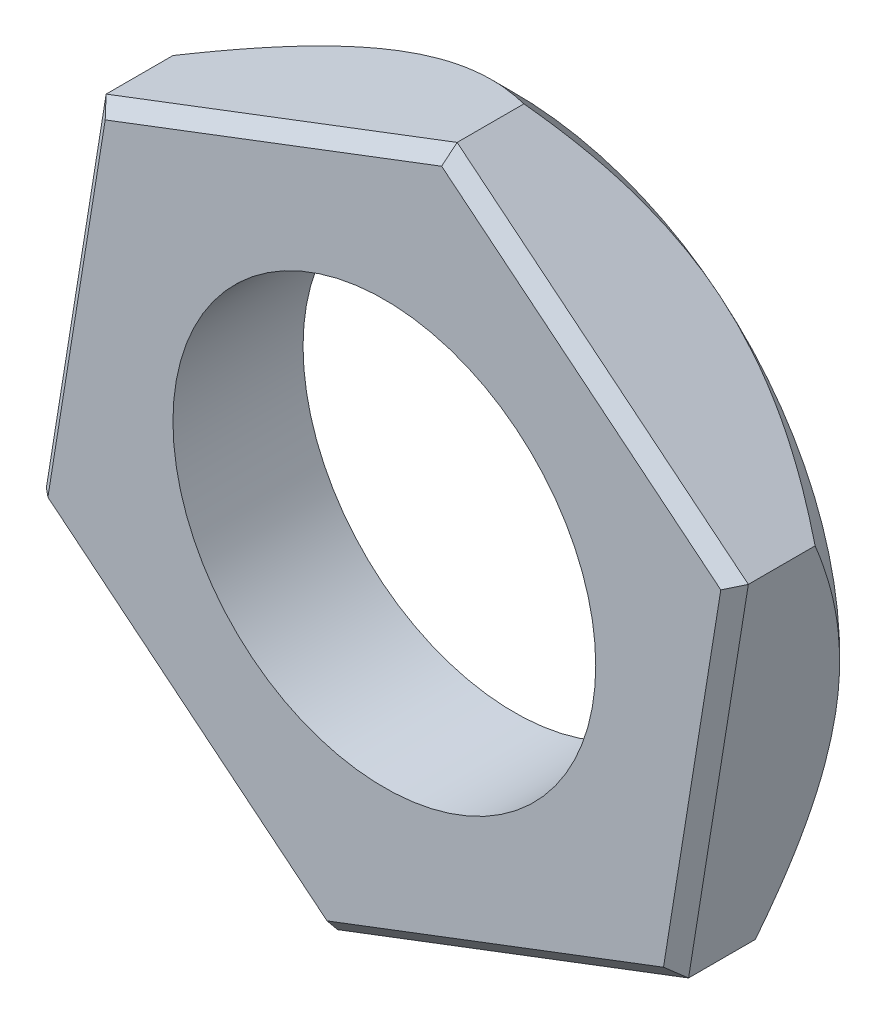
ISO-10303-21;
HEADER;
FILE_DESCRIPTION(('STEP AP214'),'2;1');
FILE_NAME('part.step','',(''),(''),'','','');
FILE_SCHEMA(('AUTOMOTIVE_DESIGN { 1 0 10303 214 1 1 1 1 }'));
ENDSEC;
DATA;
#1=APPLICATION_CONTEXT('core data for automotive mechanical design processes');
#2=APPLICATION_PROTOCOL_DEFINITION('international standard','automotive_design',2000,#1);
#3=PRODUCT_CONTEXT('',#1,'mechanical');
#4=PRODUCT('Part','Part','',(#3));
#5=PRODUCT_RELATED_PRODUCT_CATEGORY('part','',(#4));
#6=PRODUCT_DEFINITION_FORMATION('','',#4);
#7=PRODUCT_DEFINITION_CONTEXT('part definition',#1,'design');
#8=PRODUCT_DEFINITION('design','',#6,#7);
#9=PRODUCT_DEFINITION_SHAPE('','',#8);
#10=(LENGTH_UNIT() NAMED_UNIT(*) SI_UNIT(.MILLI.,.METRE.));
#11=(NAMED_UNIT(*) PLANE_ANGLE_UNIT() SI_UNIT($,.RADIAN.));
#12=(NAMED_UNIT(*) SI_UNIT($,.STERADIAN.) SOLID_ANGLE_UNIT());
#13=UNCERTAINTY_MEASURE_WITH_UNIT(LENGTH_MEASURE(1.E-05),#10,'distance_accuracy_value','');
#14=(GEOMETRIC_REPRESENTATION_CONTEXT(3) GLOBAL_UNCERTAINTY_ASSIGNED_CONTEXT((#13)) GLOBAL_UNIT_ASSIGNED_CONTEXT((#10,
#11,#12)) REPRESENTATION_CONTEXT('',''));
#15=CARTESIAN_POINT('',(0.,0.,0.));
#16=DIRECTION('',(0.,0.,1.));
#17=DIRECTION('',(1.,0.,0.));
#18=AXIS2_PLACEMENT_3D('',#15,#16,#17);
#19=CARTESIAN_POINT('',(0.,0.,0.));
#20=DIRECTION('',(0.,0.,1.));
#21=DIRECTION('',(1.,0.,0.));
#22=AXIS2_PLACEMENT_3D('',#19,#20,#21);
#23=PLANE('',#22);
#24=CARTESIAN_POINT('',(0.,0.,0.));
#25=DIRECTION('',(0.,0.,1.));
#26=DIRECTION('',(1.,0.,0.));
#27=AXIS2_PLACEMENT_3D('',#24,#25,#26);
#28=CIRCLE('',#27,3.25);
#29=CARTESIAN_POINT('',(3.25,0.,0.));
#30=VERTEX_POINT('',#29);
#31=EDGE_CURVE('E325',#30,#30,#28,.T.);
#32=ORIENTED_EDGE('',*,*,#31,.T.);
#33=EDGE_LOOP('',(#32));
#34=FACE_BOUND('',#33,.T.);
#35=CARTESIAN_POINT('',(0.,0.,0.));
#36=DIRECTION('',(0.,0.,-1.));
#37=DIRECTION('',(-1.,0.,0.));
#38=AXIS2_PLACEMENT_3D('',#35,#36,#37);
#39=CIRCLE('',#38,5.);
#40=CARTESIAN_POINT('',(-1.77905213864237,4.67279076013382,0.));
#41=VERTEX_POINT('',#40);
#42=CARTESIAN_POINT('',(3.1572294355239,3.87709972678824,0.));
#43=VERTEX_POINT('',#42);
#44=EDGE_CURVE('E135',#41,#43,#39,.T.);
#45=ORIENTED_EDGE('',*,*,#44,.T.);
#46=CARTESIAN_POINT('',(4.93628157416627,-0.795691033345577,0.));
#47=VERTEX_POINT('',#46);
#48=EDGE_CURVE('E124',#43,#47,#39,.T.);
#49=ORIENTED_EDGE('',*,*,#48,.T.);
#50=CARTESIAN_POINT('',(1.77905213864238,-4.67279076013382,0.));
#51=VERTEX_POINT('',#50);
#52=EDGE_CURVE('E136',#47,#51,#39,.T.);
#53=ORIENTED_EDGE('',*,*,#52,.T.);
#54=CARTESIAN_POINT('',(-3.15722943552389,-3.87709972678824,0.));
#55=VERTEX_POINT('',#54);
#56=EDGE_CURVE('E284',#51,#55,#39,.T.);
#57=ORIENTED_EDGE('',*,*,#56,.T.);
#58=CARTESIAN_POINT('',(-4.93628157416627,0.795691033345573,0.));
#59=VERTEX_POINT('',#58);
#60=EDGE_CURVE('E157',#55,#59,#39,.T.);
#61=ORIENTED_EDGE('',*,*,#60,.T.);
#62=EDGE_CURVE('E149',#59,#41,#39,.T.);
#63=ORIENTED_EDGE('',*,*,#62,.T.);
#64=EDGE_LOOP('',(#45,#49,#53,#57,#61,#63));
#65=FACE_BOUND('',#64,.T.);
#66=ADVANCED_FACE('F33',(#34,#65),#23,.F.);
#67=CARTESIAN_POINT('',(-4.47688914187243,3.64565452898627,2.));
#68=DIRECTION('',(0.987256314833254,-0.159138206669115,0.));
#69=DIRECTION('',(0.159138206669115,0.987256314833254,0.));
#70=AXIS2_PLACEMENT_3D('',#67,#68,#69);
#71=PLANE('',#70);
#72=DIRECTION('',(0.,0.,-1.));
#73=VECTOR('',#72,1.);
#74=CARTESIAN_POINT('',(-5.3956740064601,-2.05427246229511,2.));
#75=LINE('',#74,#73);
#76=CARTESIAN_POINT('',(-5.3956740064601,-2.05427246229511,1.8));
#77=VERTEX_POINT('',#76);
#78=CARTESIAN_POINT('',(-5.3956740064601,-2.05427246229511,0.773502691896245));
#79=VERTEX_POINT('',#78);
#80=EDGE_CURVE('E316',#77,#79,#75,.T.);
#81=ORIENTED_EDGE('',*,*,#80,.F.);
#82=DIRECTION('',(0.159138206669115,0.987256314833254,0.));
#83=VECTOR('',#82,1.);
#84=CARTESIAN_POINT('',(-4.47688914187243,3.64565452898627,1.8));
#85=LINE('',#84,#83);
#86=CARTESIAN_POINT('',(-4.47688914187243,3.64565452898627,1.8));
#87=VERTEX_POINT('',#86);
#88=EDGE_CURVE('E42',#77,#87,#85,.T.);
#89=ORIENTED_EDGE('',*,*,#88,.T.);
#90=DIRECTION('',(0.,0.,-1.));
#91=VECTOR('',#90,1.);
#92=CARTESIAN_POINT('',(-4.47688914187243,3.64565452898627,2.));
#93=LINE('',#92,#91);
#94=CARTESIAN_POINT('',(-4.47688914187243,3.64565452898627,0.773502691896249));
#95=VERTEX_POINT('',#94);
#96=EDGE_CURVE('E266',#87,#95,#93,.T.);
#97=ORIENTED_EDGE('',*,*,#96,.T.);
#98=CARTESIAN_POINT('',(-5.39570624493846,-2.05447246229511,0.773603985380079));
#99=CARTESIAN_POINT('',(-5.37990828535588,-1.95646560595417,0.72397285033257));
#100=CARTESIAN_POINT('',(-5.36398889478862,-1.85770542010827,0.675864812806547));
#101=CARTESIAN_POINT('',(-5.331883428467,-1.65853059572059,0.583158255487634));
#102=CARTESIAN_POINT('',(-5.31569721281281,-1.55811508927293,0.53856165245695));
#103=CARTESIAN_POINT('',(-5.26655221862284,-1.25323100849795,0.410353673917441));
#104=CARTESIAN_POINT('',(-5.23317740223007,-1.04618143234764,0.33287107448098));
#105=CARTESIAN_POINT('',(-5.1658744149064,-0.628649397563627,0.200187428722699));
#106=CARTESIAN_POINT('',(-5.13196344630485,-0.418273658168715,0.144652105392841));
#107=CARTESIAN_POINT('',(-5.08053948212892,-0.0992513791756916,0.0804113577927177));
#108=CARTESIAN_POINT('',(-5.06332245046184,0.00755906937582048,0.0621834059785219));
#109=CARTESIAN_POINT('',(-5.02874260781945,0.222084347303721,0.0324940647279748));
#110=CARTESIAN_POINT('',(-5.01137981902437,0.329799039079164,0.0210316640346012));
#111=CARTESIAN_POINT('',(-4.96906921569646,0.592284153082797,0.00181334794427144));
#112=CARTESIAN_POINT('',(-4.94407581347038,0.74733739072657,-0.00221906551645336));
#113=CARTESIAN_POINT('',(-4.89413405452889,1.05716441417283,0.00454880191539594));
#114=CARTESIAN_POINT('',(-4.86918571667283,1.21193808297632,0.015354282269621));
#115=CARTESIAN_POINT('',(-4.81952424835932,1.52002624874503,0.0511609953830387));
#116=CARTESIAN_POINT('',(-4.79481141241852,1.67333891859756,0.0761781035664301));
#117=CARTESIAN_POINT('',(-4.74581049334059,1.97732919098329,0.139047982880621));
#118=CARTESIAN_POINT('',(-4.72152237778431,2.12800699463731,0.17689976979624));
#119=CARTESIAN_POINT('',(-4.67840639539026,2.39548849251082,0.254772950518885));
#120=CARTESIAN_POINT('',(-4.6594830610612,2.51288444477833,0.292746394018213));
#121=CARTESIAN_POINT('',(-4.62197609245859,2.7455689294048,0.374812647595885));
#122=CARTESIAN_POINT('',(-4.60339246851088,2.8608573977046,0.418905643335503));
#123=CARTESIAN_POINT('',(-4.56662345225735,3.08896379808638,0.512222579898621));
#124=CARTESIAN_POINT('',(-4.54843701421571,3.20178821766949,0.561430385197737));
#125=CARTESIAN_POINT('',(-4.51240090460815,3.42534783617175,0.664330881237279));
#126=CARTESIAN_POINT('',(-4.49455103461817,3.53608426606757,0.718020821301213));
#127=CARTESIAN_POINT('',(-4.47685690339407,3.64585452898627,0.773603985380083));
#128=B_SPLINE_CURVE_WITH_KNOTS('',3,(#98,#99,#100,#101,#102,#103,#104,#105,#106,#107,#108,#109,
#110,#111,#112,#113,#114,#115,#116,#117,#118,#119,#120,#121,#122,#123,#124,#125,#126,#127),
.UNSPECIFIED.,.F.,.F.,(4,2,2,2,2,2,2,2,2,2,2,2,2,2,4),(0.,0.332942258609129,0.666065015968434,
1.33590706242885,1.99511252166244,2.32406874369522,2.65297578369077,3.12356282013711,
3.59431480073053,4.06559368258843,4.53683643304182,4.91114298755202,5.28546090064319,
5.65863187874306,6.03157550285055),.UNSPECIFIED.);
#129=EDGE_CURVE('E148',#59,#95,#128,.T.);
#130=ORIENTED_EDGE('',*,*,#129,.F.);
#131=EDGE_CURVE('E154',#79,#59,#128,.T.);
#132=ORIENTED_EDGE('',*,*,#131,.F.);
#133=EDGE_LOOP('',(#81,#89,#97,#130,#132));
#134=FACE_BOUND('',#133,.T.);
#135=ADVANCED_FACE('F219',(#134),#71,.F.);
#136=CARTESIAN_POINT('',(-5.3956740064601,-2.05427246229511,2.));
#137=DIRECTION('',(0.631445887104779,0.775419945357648,0.));
#138=DIRECTION('',(-0.775419945357648,0.631445887104779,0.));
#139=AXIS2_PLACEMENT_3D('',#136,#137,#138);
#140=PLANE('',#139);
#141=DIRECTION('',(0.,0.,-1.));
#142=VECTOR('',#141,1.);
#143=CARTESIAN_POINT('',(-0.918784864587673,-5.69992699128137,2.));
#144=LINE('',#143,#142);
#145=CARTESIAN_POINT('',(-0.918784864587673,-5.69992699128137,1.8));
#146=VERTEX_POINT('',#145);
#147=CARTESIAN_POINT('',(-0.918784864587673,-5.69992699128137,0.773502691896252));
#148=VERTEX_POINT('',#147);
#149=EDGE_CURVE('E317',#146,#148,#144,.T.);
#150=ORIENTED_EDGE('',*,*,#149,.F.);
#151=DIRECTION('',(-0.775419945357648,0.631445887104779,0.));
#152=VECTOR('',#151,1.);
#153=CARTESIAN_POINT('',(-5.3956740064601,-2.05427246229511,1.8));
#154=LINE('',#153,#152);
#155=EDGE_CURVE('E57',#146,#77,#154,.T.);
#156=ORIENTED_EDGE('',*,*,#155,.T.);
#157=ORIENTED_EDGE('',*,*,#80,.T.);
#158=CARTESIAN_POINT('',(-0.918584864587673,-5.70008985680757,0.773631658594961));
#159=CARTESIAN_POINT('',(-0.995563605871024,-5.63740394078376,0.723998976215254));
#160=CARTESIAN_POINT('',(-1.07313405041158,-5.57423618444828,0.675889411018732));
#161=CARTESIAN_POINT('',(-1.22957443703417,-5.44684245502293,0.583179854846174));
#162=CARTESIAN_POINT('',(-1.30844506083946,-5.38261592678697,0.538581780728499));
#163=CARTESIAN_POINT('',(-1.54791411579233,-5.18760965857818,0.410369462227134));
#164=CARTESIAN_POINT('',(-1.71053981502556,-5.05517905818783,0.332884116564412));
#165=CARTESIAN_POINT('',(-2.03848757869879,-4.7881221327161,0.200195640062594));
#166=CARTESIAN_POINT('',(-2.20372581509662,-4.6535640711257,0.144658208167137));
#167=CARTESIAN_POINT('',(-2.4542998541133,-4.44951470755234,0.0804149254963863));
#168=CARTESIAN_POINT('',(-2.53819345831217,-4.38119782759211,0.0621862342483763));
#169=CARTESIAN_POINT('',(-2.7066910351602,-4.2439855950144,0.0324956538378238));
#170=CARTESIAN_POINT('',(-2.79129489971842,-4.17509033041836,0.0210327533004237));
#171=CARTESIAN_POINT('',(-2.99746010047066,-4.00720431090272,0.00181374936369778));
#172=CARTESIAN_POINT('',(-3.11924356609716,-3.90803266984859,-0.00221897638376468));
#173=CARTESIAN_POINT('',(-3.36259103085079,-3.70986810537484,0.0045483025111792));
#174=CARTESIAN_POINT('',(-3.48415493808896,-3.61087525678295,0.0153535067560873));
#175=CARTESIAN_POINT('',(-3.72613670058024,-3.4138228213971,0.0511597199350075));
#176=CARTESIAN_POINT('',(-3.84655312068625,-3.31576440328309,0.0761766054147195));
#177=CARTESIAN_POINT('',(-4.08531630797688,-3.12133294261547,0.139046097796503));
#178=CARTESIAN_POINT('',(-4.20366323311952,-3.02495977143227,0.176897720527023));
#179=CARTESIAN_POINT('',(-4.41375556177589,-2.85387578315397,0.25477222494053));
#180=CARTESIAN_POINT('',(-4.50596606949126,-2.77878621885619,0.292747464177998));
#181=CARTESIAN_POINT('',(-4.68873170335424,-2.62995511321105,0.374817859296279));
#182=CARTESIAN_POINT('',(-4.77928677909673,-2.55621361290996,0.418913201173826));
#183=CARTESIAN_POINT('',(-4.95845634135226,-2.41031088773769,0.512235259951131));
#184=CARTESIAN_POINT('',(-5.04707592365872,-2.33814551322111,0.561445840472175));
#185=CARTESIAN_POINT('',(-5.22267400080559,-2.19515114705639,0.664352218675704));
#186=CARTESIAN_POINT('',(-5.30965346277337,-2.1243213678497,0.718045264912606));
#187=CARTESIAN_POINT('',(-5.3958740064601,-2.05410959676892,0.773631658594954));
#188=B_SPLINE_CURVE_WITH_KNOTS('',3,(#158,#159,#160,#161,#162,#163,#164,#165,#166,#167,#168,
#169,#170,#171,#172,#173,#174,#175,#176,#177,#178,#179,#180,#181,#182,#183,#184,#185,#186,#187),
.UNSPECIFIED.,.F.,.F.,(4,2,2,2,2,2,2,2,2,2,2,2,2,2,4),(0.,0.332948811205332,0.666078130797143,
1.33593358429308,1.99515175665752,2.32411428241964,2.65302762121182,3.12361516086703,
3.59436764891164,4.06564707408729,4.5368903695827,4.91121437560114,5.285549760235,
5.65873818995851,6.03169920858849),.UNSPECIFIED.);
#189=EDGE_CURVE('E200',#55,#79,#188,.T.);
#190=ORIENTED_EDGE('',*,*,#189,.F.);
#191=EDGE_CURVE('E207',#148,#55,#188,.T.);
#192=ORIENTED_EDGE('',*,*,#191,.F.);
#193=EDGE_LOOP('',(#150,#156,#157,#190,#192));
#194=FACE_BOUND('',#193,.T.);
#195=ADVANCED_FACE('F215',(#194),#140,.F.);
#196=CARTESIAN_POINT('',(-0.918784864587673,-5.69992699128137,2.));
#197=DIRECTION('',(-0.355810427728475,0.934558152026764,0.));
#198=DIRECTION('',(-0.934558152026764,-0.355810427728475,0.));
#199=AXIS2_PLACEMENT_3D('',#196,#197,#198);
#200=PLANE('',#199);
#201=DIRECTION('',(0.,0.,-1.));
#202=VECTOR('',#201,1.);
#203=CARTESIAN_POINT('',(4.47688914187243,-3.64565452898627,2.));
#204=LINE('',#203,#202);
#205=CARTESIAN_POINT('',(4.47688914187243,-3.64565452898627,1.8));
#206=VERTEX_POINT('',#205);
#207=CARTESIAN_POINT('',(4.47688914187243,-3.64565452898627,0.773502691896254));
#208=VERTEX_POINT('',#207);
#209=EDGE_CURVE('E319',#206,#208,#204,.T.);
#210=ORIENTED_EDGE('',*,*,#209,.F.);
#211=DIRECTION('',(-0.934558152026764,-0.355810427728475,0.));
#212=VECTOR('',#211,1.);
#213=CARTESIAN_POINT('',(-0.918784864587673,-5.69992699128137,1.8));
#214=LINE('',#213,#212);
#215=EDGE_CURVE('E302',#206,#146,#214,.T.);
#216=ORIENTED_EDGE('',*,*,#215,.T.);
#217=ORIENTED_EDGE('',*,*,#149,.T.);
#218=CARTESIAN_POINT('',(4.47708914187243,-3.64557838382035,0.773609697308102));
#219=CARTESIAN_POINT('',(4.38431341290819,-3.68090050019588,0.723978242883002));
#220=CARTESIAN_POINT('',(4.29082456191776,-3.71649412054642,0.675869890037632));
#221=CARTESIAN_POINT('',(4.10228070881357,-3.78827763543321,0.58316271373922));
#222=CARTESIAN_POINT('',(4.00722488511025,-3.82446784276981,0.538565807068231));
#223=CARTESIAN_POINT('',(3.71861398581189,-3.93434946683327,0.410356932737147));
#224=CARTESIAN_POINT('',(3.52261565976664,-4.00897109211468,0.332873766464515));
#225=CARTESIAN_POINT('',(3.12736934730612,-4.15945157231775,0.200189123612537));
#226=CARTESIAN_POINT('',(2.92822238552665,-4.23527196455114,0.144653365061576));
#227=CARTESIAN_POINT('',(2.62622785538643,-4.35024908256977,0.0804120942050887));
#228=CARTESIAN_POINT('',(2.52511839009278,-4.38874406762287,0.0621839897661531));
#229=CARTESIAN_POINT('',(2.32204334279953,-4.46605998347219,0.0324943927425218));
#230=CARTESIAN_POINT('',(2.22007789105971,-4.50488086467513,0.0210318888764828));
#231=CARTESIAN_POINT('',(1.97160338329359,-4.59948152777582,0.00181343080414));
#232=CARTESIAN_POINT('',(1.82482660859734,-4.65536323708627,-0.00221904711893458));
#233=CARTESIAN_POINT('',(1.53153758859728,-4.76702594253481,0.00454869882595687));
#234=CARTESIAN_POINT('',(1.38502545404588,-4.82280689650657,0.015354122184644));
#235=CARTESIAN_POINT('',(1.09338246250319,-4.93384291640515,0.051160732098622));
#236=CARTESIAN_POINT('',(0.948253335115995,-4.989097323827,0.0761777943095992));
#237=CARTESIAN_POINT('',(0.660489490510607,-5.09865645228977,0.139047593748669));
#238=CARTESIAN_POINT('',(0.517854582909122,-5.15296124581453,0.176899346770588));
#239=CARTESIAN_POINT('',(0.264649688189689,-5.24936288941229,0.254772800710026));
#240=CARTESIAN_POINT('',(0.153519074863463,-5.29167318436352,0.292746614864332));
#241=CARTESIAN_POINT('',(-0.066747184667469,-5.37553423875365,0.374813723289037));
#242=CARTESIAN_POINT('',(-0.175882770209708,-5.41708497509678,0.418907203289946));
#243=CARTESIAN_POINT('',(-0.391815239061008,-5.49929604343514,0.512225197118304));
#244=CARTESIAN_POINT('',(-0.498618263658515,-5.53995871357751,0.561433575245017));
#245=CARTESIAN_POINT('',(-0.710246573500962,-5.62053107740655,0.664335285409892));
#246=CARTESIAN_POINT('',(-0.815073024085237,-5.660441214768,0.718025866612823));
#247=CARTESIAN_POINT('',(-0.918984864587673,-5.70000313644729,0.773609697308099));
#248=B_SPLINE_CURVE_WITH_KNOTS('',3,(#218,#219,#220,#221,#222,#223,#224,#225,#226,#227,#228,
#229,#230,#231,#232,#233,#234,#235,#236,#237,#238,#239,#240,#241,#242,#243,#244,#245,#246,#247),
.UNSPECIFIED.,.F.,.F.,(4,2,2,2,2,2,2,2,2,2,2,2,2,2,4),(0.,0.332943611096375,0.666067722931879,
1.33591253666756,1.99512061995379,2.32407814310749,2.65298648320583,3.12357362350935,
3.59432570883553,4.06560470282939,4.53684756577468,4.91115772244533,5.28547924183195,
5.65865382211516,6.03160103662041),.UNSPECIFIED.);
#249=EDGE_CURVE('E208',#51,#148,#248,.T.);
#250=ORIENTED_EDGE('',*,*,#249,.F.);
#251=EDGE_CURVE('E326',#208,#51,#248,.T.);
#252=ORIENTED_EDGE('',*,*,#251,.F.);
#253=EDGE_LOOP('',(#210,#216,#217,#250,#252));
#254=FACE_BOUND('',#253,.T.);
#255=ADVANCED_FACE('F218',(#254),#200,.F.);
#256=CARTESIAN_POINT('',(4.47688914187243,-3.64565452898627,2.));
#257=DIRECTION('',(-0.987256314833254,0.159138206669115,0.));
#258=DIRECTION('',(-0.159138206669115,-0.987256314833254,0.));
#259=AXIS2_PLACEMENT_3D('',#256,#257,#258);
#260=PLANE('',#259);
#261=DIRECTION('',(0.,0.,-1.));
#262=VECTOR('',#261,1.);
#263=CARTESIAN_POINT('',(5.39567400646011,2.05427246229511,2.));
#264=LINE('',#263,#262);
#265=CARTESIAN_POINT('',(5.39567400646011,2.05427246229511,1.8));
#266=VERTEX_POINT('',#265);
#267=CARTESIAN_POINT('',(5.39567400646011,2.05427246229511,0.773502691896252));
#268=VERTEX_POINT('',#267);
#269=EDGE_CURVE('E153',#266,#268,#264,.T.);
#270=ORIENTED_EDGE('',*,*,#269,.F.);
#271=DIRECTION('',(-0.159138206669115,-0.987256314833254,0.));
#272=VECTOR('',#271,1.);
#273=CARTESIAN_POINT('',(4.47688914187243,-3.64565452898627,1.8));
#274=LINE('',#273,#272);
#275=EDGE_CURVE('E300',#266,#206,#274,.T.);
#276=ORIENTED_EDGE('',*,*,#275,.T.);
#277=ORIENTED_EDGE('',*,*,#209,.T.);
#278=CARTESIAN_POINT('',(5.39570624493846,2.05447246229511,0.773603985380087));
#279=CARTESIAN_POINT('',(5.37990828535589,1.95646560595417,0.723972850332577));
#280=CARTESIAN_POINT('',(5.36398889478863,1.85770542010827,0.675864812806554));
#281=CARTESIAN_POINT('',(5.33188342846701,1.65853059572059,0.58315825548764));
#282=CARTESIAN_POINT('',(5.31569721281282,1.55811508927293,0.538561652456957));
#283=CARTESIAN_POINT('',(5.26655221862284,1.25323100849794,0.410353673917447));
#284=CARTESIAN_POINT('',(5.23317740223008,1.04618143234763,0.332871074480986));
#285=CARTESIAN_POINT('',(5.16587441490641,0.628649397563623,0.200187428722705));
#286=CARTESIAN_POINT('',(5.13196344630485,0.41827365816871,0.144652105392847));
#287=CARTESIAN_POINT('',(5.08053948212893,0.0992513791756861,0.0804113577927235));
#288=CARTESIAN_POINT('',(5.06332245046184,-0.00755906937582606,0.0621834059785275));
#289=CARTESIAN_POINT('',(5.02874260781945,-0.222084347303727,0.03249406472798));
#290=CARTESIAN_POINT('',(5.01137981902437,-0.32979903907917,0.0210316640346062));
#291=CARTESIAN_POINT('',(4.96906921569647,-0.592284153082804,0.00181334794427639));
#292=CARTESIAN_POINT('',(4.94407581347038,-0.747337390726577,-0.00221906551644811));
#293=CARTESIAN_POINT('',(4.89413405452889,-1.05716441417284,0.00454880191540164));
#294=CARTESIAN_POINT('',(4.86918571667283,-1.21193808297633,0.0153542822696268));
#295=CARTESIAN_POINT('',(4.81952424835932,-1.52002624874504,0.0511609953830447));
#296=CARTESIAN_POINT('',(4.79481141241853,-1.67333891859756,0.076178103566436));
#297=CARTESIAN_POINT('',(4.7458104933406,-1.9773291909833,0.139047982880628));
#298=CARTESIAN_POINT('',(4.72152237778431,-2.12800699463732,0.176899769796248));
#299=CARTESIAN_POINT('',(4.67840639539027,-2.39548849251083,0.254772950518893));
#300=CARTESIAN_POINT('',(4.65948306106121,-2.51288444477834,0.292746394018221));
#301=CARTESIAN_POINT('',(4.62197609245859,-2.74556892940481,0.374812647595892));
#302=CARTESIAN_POINT('',(4.60339246851089,-2.86085739770461,0.41890564333551));
#303=CARTESIAN_POINT('',(4.56662345225736,-3.08896379808638,0.512222579898628));
#304=CARTESIAN_POINT('',(4.54843701421571,-3.2017882176695,0.561430385197743));
#305=CARTESIAN_POINT('',(4.51240090460816,-3.42534783617176,0.664330881237284));
#306=CARTESIAN_POINT('',(4.49455103461818,-3.53608426606757,0.718020821301217));
#307=CARTESIAN_POINT('',(4.47685690339408,-3.64585452898627,0.773603985380088));
#308=B_SPLINE_CURVE_WITH_KNOTS('',3,(#278,#279,#280,#281,#282,#283,#284,#285,#286,#287,#288,
#289,#290,#291,#292,#293,#294,#295,#296,#297,#298,#299,#300,#301,#302,#303,#304,#305,#306,#307),
.UNSPECIFIED.,.F.,.F.,(4,2,2,2,2,2,2,2,2,2,2,2,2,2,4),(0.,0.332942258609131,0.666065015968436,
1.33590706242885,1.99511252166244,2.32406874369523,2.65297578369078,3.12356282013712,
3.59431480073054,4.06559368258844,4.53683643304183,4.91114298755203,5.2854609006432,
5.65863187874306,6.03157550285056),.UNSPECIFIED.);
#309=EDGE_CURVE('E356',#47,#208,#308,.T.);
#310=ORIENTED_EDGE('',*,*,#309,.F.);
#311=EDGE_CURVE('E130',#268,#47,#308,.T.);
#312=ORIENTED_EDGE('',*,*,#311,.F.);
#313=EDGE_LOOP('',(#270,#276,#277,#310,#312));
#314=FACE_BOUND('',#313,.T.);
#315=ADVANCED_FACE('F264',(#314),#260,.F.);
#316=CARTESIAN_POINT('',(5.39567400646011,2.05427246229511,2.));
#317=DIRECTION('',(-0.631445887104779,-0.775419945357648,0.));
#318=DIRECTION('',(0.775419945357648,-0.631445887104779,0.));
#319=AXIS2_PLACEMENT_3D('',#316,#317,#318);
#320=PLANE('',#319);
#321=DIRECTION('',(0.,0.,-1.));
#322=VECTOR('',#321,1.);
#323=CARTESIAN_POINT('',(0.918784864587683,5.69992699128137,2.));
#324=LINE('',#323,#322);
#325=CARTESIAN_POINT('',(0.918784864587683,5.69992699128137,1.8));
#326=VERTEX_POINT('',#325);
#327=CARTESIAN_POINT('',(0.918784864587683,5.69992699128137,0.773502691896252));
#328=VERTEX_POINT('',#327);
#329=EDGE_CURVE('E271',#326,#328,#324,.T.);
#330=ORIENTED_EDGE('',*,*,#329,.F.);
#331=DIRECTION('',(0.775419945357648,-0.631445887104779,0.));
#332=VECTOR('',#331,1.);
#333=CARTESIAN_POINT('',(5.39567400646011,2.05427246229511,1.8));
#334=LINE('',#333,#332);
#335=EDGE_CURVE('E298',#326,#266,#334,.T.);
#336=ORIENTED_EDGE('',*,*,#335,.T.);
#337=ORIENTED_EDGE('',*,*,#269,.T.);
#338=CARTESIAN_POINT('',(0.918584864587683,5.70008985680757,0.773631658594961));
#339=CARTESIAN_POINT('',(0.995563605871034,5.63740394078376,0.723998976215254));
#340=CARTESIAN_POINT('',(1.07313405041159,5.57423618444828,0.675889411018733));
#341=CARTESIAN_POINT('',(1.22957443703418,5.44684245502293,0.583179854846175));
#342=CARTESIAN_POINT('',(1.30844506083947,5.38261592678697,0.538581780728501));
#343=CARTESIAN_POINT('',(1.54791411579234,5.18760965857818,0.410369462227136));
#344=CARTESIAN_POINT('',(1.71053981502557,5.05517905818783,0.332884116564415));
#345=CARTESIAN_POINT('',(2.0384875786988,4.7881221327161,0.200195640062598));
#346=CARTESIAN_POINT('',(2.20372581509662,4.65356407112571,0.144658208167142));
#347=CARTESIAN_POINT('',(2.45429985411331,4.44951470755235,0.0804149254963914));
#348=CARTESIAN_POINT('',(2.53819345831218,4.38119782759211,0.0621862342483813));
#349=CARTESIAN_POINT('',(2.7066910351602,4.2439855950144,0.0324956538378293));
#350=CARTESIAN_POINT('',(2.79129489971842,4.17509033041837,0.0210327533004299));
#351=CARTESIAN_POINT('',(2.99746010047067,4.00720431090272,0.00181374936370413));
#352=CARTESIAN_POINT('',(3.11924356609717,3.90803266984859,-0.00221897638375924));
#353=CARTESIAN_POINT('',(3.3625910308508,3.70986810537485,0.0045483025111846));
#354=CARTESIAN_POINT('',(3.48415493808896,3.61087525678295,0.0153535067560935));
#355=CARTESIAN_POINT('',(3.72613670058025,3.4138228213971,0.0511597199350139));
#356=CARTESIAN_POINT('',(3.84655312068626,3.31576440328309,0.0761766054147251));
#357=CARTESIAN_POINT('',(4.08531630797688,3.12133294261547,0.139046097796509));
#358=CARTESIAN_POINT('',(4.20366323311953,3.02495977143227,0.17689772052703));
#359=CARTESIAN_POINT('',(4.4137555617759,2.85387578315397,0.254772224940537));
#360=CARTESIAN_POINT('',(4.50596606949127,2.77878621885619,0.292747464178004));
#361=CARTESIAN_POINT('',(4.68873170335424,2.62995511321105,0.374817859296285));
#362=CARTESIAN_POINT('',(4.77928677909673,2.55621361290997,0.418913201173833));
#363=CARTESIAN_POINT('',(4.95845634135226,2.41031088773769,0.512235259951138));
#364=CARTESIAN_POINT('',(5.04707592365873,2.33814551322111,0.561445840472183));
#365=CARTESIAN_POINT('',(5.22267400080559,2.19515114705639,0.664352218675711));
#366=CARTESIAN_POINT('',(5.30965346277338,2.1243213678497,0.718045264912613));
#367=CARTESIAN_POINT('',(5.39587400646011,2.05410959676892,0.773631658594961));
#368=B_SPLINE_CURVE_WITH_KNOTS('',3,(#338,#339,#340,#341,#342,#343,#344,#345,#346,#347,#348,
#349,#350,#351,#352,#353,#354,#355,#356,#357,#358,#359,#360,#361,#362,#363,#364,#365,#366,#367),
.UNSPECIFIED.,.F.,.F.,(4,2,2,2,2,2,2,2,2,2,2,2,2,2,4),(0.,0.33294881120533,0.66607813079714,
1.33593358429307,1.99515175665751,2.32411428241963,2.65302762121181,3.12361516086702,
3.59436764891163,4.06564707408728,4.53689036958269,4.91121437560113,5.28554976023499,
5.6587381899585,6.03169920858849),.UNSPECIFIED.);
#369=EDGE_CURVE('E128',#43,#268,#368,.T.);
#370=ORIENTED_EDGE('',*,*,#369,.F.);
#371=EDGE_CURVE('E142',#328,#43,#368,.T.);
#372=ORIENTED_EDGE('',*,*,#371,.F.);
#373=EDGE_LOOP('',(#330,#336,#337,#370,#372));
#374=FACE_BOUND('',#373,.T.);
#375=ADVANCED_FACE('F151',(#374),#320,.F.);
#376=CARTESIAN_POINT('',(0.918784864587683,5.69992699128137,2.));
#377=DIRECTION('',(0.355810427728475,-0.934558152026764,0.));
#378=DIRECTION('',(0.934558152026764,0.355810427728475,0.));
#379=AXIS2_PLACEMENT_3D('',#376,#377,#378);
#380=PLANE('',#379);
#381=ORIENTED_EDGE('',*,*,#96,.F.);
#382=DIRECTION('',(0.934558152026764,0.355810427728475,0.));
#383=VECTOR('',#382,1.);
#384=CARTESIAN_POINT('',(0.918784864587683,5.69992699128137,1.8));
#385=LINE('',#384,#383);
#386=EDGE_CURVE('E12',#87,#326,#385,.T.);
#387=ORIENTED_EDGE('',*,*,#386,.T.);
#388=ORIENTED_EDGE('',*,*,#329,.T.);
#389=CARTESIAN_POINT('',(-4.47708914187243,3.64557838382035,0.773609697308097));
#390=CARTESIAN_POINT('',(-4.38431341290819,3.68090050019588,0.723978242882996));
#391=CARTESIAN_POINT('',(-4.29082456191776,3.71649412054642,0.675869890037626));
#392=CARTESIAN_POINT('',(-4.10228070881357,3.7882776354332,0.583162713739215));
#393=CARTESIAN_POINT('',(-4.00722488511025,3.82446784276981,0.538565807068227));
#394=CARTESIAN_POINT('',(-3.71861398581189,3.93434946683327,0.410356932737143));
#395=CARTESIAN_POINT('',(-3.52261565976664,4.00897109211467,0.332873766464511));
#396=CARTESIAN_POINT('',(-3.12736934730612,4.15945157231774,0.200189123612532));
#397=CARTESIAN_POINT('',(-2.92822238552665,4.23527196455113,0.144653365061571));
#398=CARTESIAN_POINT('',(-2.62622785538642,4.35024908256976,0.0804120942050841));
#399=CARTESIAN_POINT('',(-2.52511839009278,4.38874406762287,0.0621839897661487));
#400=CARTESIAN_POINT('',(-2.32204334279953,4.46605998347218,0.0324943927425171));
#401=CARTESIAN_POINT('',(-2.22007789105971,4.50488086467512,0.0210318888764777));
#402=CARTESIAN_POINT('',(-1.97160338329359,4.59948152777581,0.00181343080413479));
#403=CARTESIAN_POINT('',(-1.82482660859734,4.65536323708627,-0.00221904711893914));
#404=CARTESIAN_POINT('',(-1.53153758859728,4.7670259425348,0.00454869882595253));
#405=CARTESIAN_POINT('',(-1.38502545404588,4.82280689650657,0.0153541221846392));
#406=CARTESIAN_POINT('',(-1.09338246250319,4.93384291640514,0.0511607320986169));
#407=CARTESIAN_POINT('',(-0.948253335115995,4.98909732382699,0.0761777943095943));
#408=CARTESIAN_POINT('',(-0.660489490510607,5.09865645228977,0.139047593748664));
#409=CARTESIAN_POINT('',(-0.517854582909122,5.15296124581453,0.176899346770583));
#410=CARTESIAN_POINT('',(-0.264649688189689,5.24936288941229,0.254772800710022));
#411=CARTESIAN_POINT('',(-0.153519074863461,5.29167318436352,0.292746614864327));
#412=CARTESIAN_POINT('',(0.0667471846674725,5.37553423875365,0.374813723289034));
#413=CARTESIAN_POINT('',(0.175882770209713,5.41708497509677,0.418907203289944));
#414=CARTESIAN_POINT('',(0.391815239061014,5.49929604343514,0.512225197118303));
#415=CARTESIAN_POINT('',(0.498618263658522,5.53995871357751,0.561433575245016));
#416=CARTESIAN_POINT('',(0.710246573500971,5.62053107740655,0.664335285409891));
#417=CARTESIAN_POINT('',(0.815073024085247,5.660441214768,0.718025866612823));
#418=CARTESIAN_POINT('',(0.918984864587683,5.70000313644729,0.7736096973081));
#419=B_SPLINE_CURVE_WITH_KNOTS('',3,(#389,#390,#391,#392,#393,#394,#395,#396,#397,#398,#399,
#400,#401,#402,#403,#404,#405,#406,#407,#408,#409,#410,#411,#412,#413,#414,#415,#416,#417,#418),
.UNSPECIFIED.,.F.,.F.,(4,2,2,2,2,2,2,2,2,2,2,2,2,2,4),(0.,0.332943611096375,0.666067722931879,
1.33591253666755,1.99512061995379,2.32407814310748,2.65298648320583,3.12357362350935,
3.59432570883553,4.06560470282938,4.53684756577468,4.91115772244533,5.28547924183195,
5.65865382211516,6.03160103662042),.UNSPECIFIED.);
#420=EDGE_CURVE('E145',#41,#328,#419,.T.);
#421=ORIENTED_EDGE('',*,*,#420,.F.);
#422=EDGE_CURVE('E268',#95,#41,#419,.T.);
#423=ORIENTED_EDGE('',*,*,#422,.F.);
#424=EDGE_LOOP('',(#381,#387,#388,#421,#423));
#425=FACE_BOUND('',#424,.T.);
#426=ADVANCED_FACE('F255',(#425),#380,.F.);
#427=CARTESIAN_POINT('',(0.,0.,2.));
#428=DIRECTION('',(0.,0.,1.));
#429=DIRECTION('',(1.,0.,0.));
#430=AXIS2_PLACEMENT_3D('',#427,#428,#429);
#431=PLANE('',#430);
#432=DIRECTION('',(0.775419945357648,-0.631445887104779,0.));
#433=VECTOR('',#432,1.);
#434=CARTESIAN_POINT('',(-0.788008593064596,-5.53933281941424,2.));
#435=LINE('',#434,#433);
#436=CARTESIAN_POINT('',(-5.17217864657925,-1.96918200599544,2.));
#437=VERTEX_POINT('',#436);
#438=CARTESIAN_POINT('',(-0.880727681422371,-5.46382910384678,2.));
#439=VERTEX_POINT('',#438);
#440=EDGE_CURVE('E312',#437,#439,#435,.T.);
#441=ORIENTED_EDGE('',*,*,#440,.T.);
#442=DIRECTION('',(0.934558152026764,0.355810427728475,0.));
#443=VECTOR('',#442,1.);
#444=CARTESIAN_POINT('',(4.40319864509731,-3.45210186970151,2.));
#445=LINE('',#444,#443);
#446=CARTESIAN_POINT('',(4.29145096515688,-3.49464709785134,2.));
#447=VERTEX_POINT('',#446);
#448=EDGE_CURVE('E305',#439,#447,#445,.T.);
#449=ORIENTED_EDGE('',*,*,#448,.T.);
#450=DIRECTION('',(0.159138206669115,0.987256314833254,0.));
#451=VECTOR('',#450,1.);
#452=CARTESIAN_POINT('',(5.19120723816191,2.08723094971274,2.));
#453=LINE('',#452,#451);
#454=CARTESIAN_POINT('',(5.17217864657926,1.96918200599544,2.));
#455=VERTEX_POINT('',#454);
#456=EDGE_CURVE('E308',#447,#455,#453,.T.);
#457=ORIENTED_EDGE('',*,*,#456,.T.);
#458=DIRECTION('',(-0.775419945357648,0.631445887104779,0.));
#459=VECTOR('',#458,1.);
#460=CARTESIAN_POINT('',(0.788008593064607,5.53933281941424,2.));
#461=LINE('',#460,#459);
#462=CARTESIAN_POINT('',(0.880727681422382,5.46382910384678,2.));
#463=VERTEX_POINT('',#462);
#464=EDGE_CURVE('E310',#455,#463,#461,.T.);
#465=ORIENTED_EDGE('',*,*,#464,.T.);
#466=DIRECTION('',(-0.934558152026764,-0.355810427728475,0.));
#467=VECTOR('',#466,1.);
#468=CARTESIAN_POINT('',(-4.4031986450973,3.4521018697015,2.));
#469=LINE('',#468,#467);
#470=CARTESIAN_POINT('',(-4.29145096515687,3.49464709785134,2.));
#471=VERTEX_POINT('',#470);
#472=EDGE_CURVE('E314',#463,#471,#469,.T.);
#473=ORIENTED_EDGE('',*,*,#472,.T.);
#474=DIRECTION('',(-0.159138206669115,-0.987256314833254,0.));
#475=VECTOR('',#474,1.);
#476=CARTESIAN_POINT('',(-5.1912072381619,-2.08723094971274,2.));
#477=LINE('',#476,#475);
#478=EDGE_CURVE('E283',#471,#437,#477,.T.);
#479=ORIENTED_EDGE('',*,*,#478,.T.);
#480=EDGE_LOOP('',(#441,#449,#457,#465,#473,#479));
#481=FACE_BOUND('',#480,.T.);
#482=CARTESIAN_POINT('',(0.,0.,2.));
#483=DIRECTION('',(0.,0.,1.));
#484=DIRECTION('',(1.,0.,0.));
#485=AXIS2_PLACEMENT_3D('',#482,#483,#484);
#486=CIRCLE('',#485,3.25);
#487=CARTESIAN_POINT('',(3.25,0.,2.));
#488=VERTEX_POINT('',#487);
#489=EDGE_CURVE('E272',#488,#488,#486,.T.);
#490=ORIENTED_EDGE('',*,*,#489,.F.);
#491=EDGE_LOOP('',(#490));
#492=FACE_BOUND('',#491,.T.);
#493=ADVANCED_FACE('F254',(#481,#492),#431,.T.);
#494=CARTESIAN_POINT('',(0.,0.,2.));
#495=DIRECTION('',(0.,0.,-1.));
#496=DIRECTION('',(-1.,0.,0.));
#497=AXIS2_PLACEMENT_3D('',#494,#495,#496);
#498=CYLINDRICAL_SURFACE('',#497,3.25);
#499=ORIENTED_EDGE('',*,*,#489,.T.);
#500=EDGE_LOOP('',(#499));
#501=FACE_BOUND('',#500,.T.);
#502=ORIENTED_EDGE('',*,*,#31,.F.);
#503=EDGE_LOOP('',(#502));
#504=FACE_BOUND('',#503,.T.);
#505=ADVANCED_FACE('F180',(#501,#504),#498,.F.);
#506=CARTESIAN_POINT('',(0.,0.,0.));
#507=DIRECTION('',(0.,0.,1.));
#508=DIRECTION('',(-1.,0.,0.));
#509=AXIS2_PLACEMENT_3D('',#506,#507,#508);
#510=CONICAL_SURFACE('',#509,5.,0.78539816339745);
#511=ORIENTED_EDGE('',*,*,#371,.T.);
#512=ORIENTED_EDGE('',*,*,#44,.F.);
#513=ORIENTED_EDGE('',*,*,#420,.T.);
#514=EDGE_LOOP('',(#511,#512,#513));
#515=FACE_BOUND('',#514,.T.);
#516=ADVANCED_FACE('F143',(#515),#510,.T.);
#517=ORIENTED_EDGE('',*,*,#129,.T.);
#518=ORIENTED_EDGE('',*,*,#422,.T.);
#519=ORIENTED_EDGE('',*,*,#62,.F.);
#520=EDGE_LOOP('',(#517,#518,#519));
#521=FACE_BOUND('',#520,.T.);
#522=ADVANCED_FACE('F337',(#521),#510,.T.);
#523=ORIENTED_EDGE('',*,*,#311,.T.);
#524=ORIENTED_EDGE('',*,*,#48,.F.);
#525=ORIENTED_EDGE('',*,*,#369,.T.);
#526=EDGE_LOOP('',(#523,#524,#525));
#527=FACE_BOUND('',#526,.T.);
#528=ADVANCED_FACE('F126',(#527),#510,.T.);
#529=ORIENTED_EDGE('',*,*,#251,.T.);
#530=ORIENTED_EDGE('',*,*,#52,.F.);
#531=ORIENTED_EDGE('',*,*,#309,.T.);
#532=EDGE_LOOP('',(#529,#530,#531));
#533=FACE_BOUND('',#532,.T.);
#534=ADVANCED_FACE('F174',(#533),#510,.T.);
#535=ORIENTED_EDGE('',*,*,#249,.T.);
#536=ORIENTED_EDGE('',*,*,#191,.T.);
#537=ORIENTED_EDGE('',*,*,#56,.F.);
#538=EDGE_LOOP('',(#535,#536,#537));
#539=FACE_BOUND('',#538,.T.);
#540=ADVANCED_FACE('F178',(#539),#510,.T.);
#541=ORIENTED_EDGE('',*,*,#189,.T.);
#542=ORIENTED_EDGE('',*,*,#131,.T.);
#543=ORIENTED_EDGE('',*,*,#60,.F.);
#544=EDGE_LOOP('',(#541,#542,#543));
#545=FACE_BOUND('',#544,.T.);
#546=ADVANCED_FACE('F245',(#545),#510,.T.);
#547=CARTESIAN_POINT('',(-1.70536164186725,4.47923810084906,2.));
#548=DIRECTION('',(-0.247166691918181,0.649198642986083,0.719339800338651));
#549=DIRECTION('',(0.934558152026764,0.355810427728475,0.));
#550=AXIS2_PLACEMENT_3D('',#547,#548,#549);
#551=PLANE('',#550);
#552=DIRECTION('',(0.122074398922823,0.757321096791149,-0.641531446994364));
#553=VECTOR('',#552,1.);
#554=CARTESIAN_POINT('',(0.751164404127061,4.66004875243025,2.68088737273364));
#555=LINE('',#554,#553);
#556=EDGE_CURVE('E279',#326,#463,#555,.F.);
#557=ORIENTED_EDGE('',*,*,#556,.F.);
#558=ORIENTED_EDGE('',*,*,#386,.F.);
#559=DIRECTION('',(0.594822109181619,-0.484380079014454,0.641531446994363));
#560=VECTOR('',#559,1.);
#561=CARTESIAN_POINT('',(-3.66013840041503,2.98055183260776,2.68088737273364));
#562=LINE('',#561,#560);
#563=EDGE_CURVE('E37',#471,#87,#562,.F.);
#564=ORIENTED_EDGE('',*,*,#563,.F.);
#565=ORIENTED_EDGE('',*,*,#472,.F.);
#566=EDGE_LOOP('',(#557,#558,#564,#565));
#567=FACE_BOUND('',#566,.T.);
#568=ADVANCED_FACE('F35',(#567),#551,.T.);
#569=CARTESIAN_POINT('',(-4.73181480586806,0.762732545927946,2.));
#570=DIRECTION('',(-0.685805862887422,0.110546687322534,0.719339800338652));
#571=DIRECTION('',(0.159138206669115,0.987256314833254,0.));
#572=AXIS2_PLACEMENT_3D('',#569,#570,#571);
#573=PLANE('',#572);
#574=ORIENTED_EDGE('',*,*,#563,.T.);
#575=ORIENTED_EDGE('',*,*,#88,.F.);
#576=DIRECTION('',(0.716896508104441,0.272941017776693,0.641531446994363));
#577=VECTOR('',#576,1.);
#578=CARTESIAN_POINT('',(-4.4113028045421,-1.67949691982249,2.68088737273364));
#579=LINE('',#578,#577);
#580=EDGE_CURVE('E285',#437,#77,#579,.F.);
#581=ORIENTED_EDGE('',*,*,#580,.F.);
#582=ORIENTED_EDGE('',*,*,#478,.F.);
#583=EDGE_LOOP('',(#574,#575,#581,#582));
#584=FACE_BOUND('',#583,.T.);
#585=ADVANCED_FACE('F238',(#584),#573,.T.);
#586=CARTESIAN_POINT('',(3.02645316400082,3.71650555492111,2.));
#587=DIRECTION('',(0.438639170969242,0.538651955663549,0.719339800338651));
#588=DIRECTION('',(0.775419945357648,-0.631445887104779,0.));
#589=AXIS2_PLACEMENT_3D('',#586,#587,#588);
#590=PLANE('',#589);
#591=ORIENTED_EDGE('',*,*,#556,.T.);
#592=ORIENTED_EDGE('',*,*,#464,.F.);
#593=DIRECTION('',(0.71689650810444,0.272941017776695,-0.641531446994364));
#594=VECTOR('',#593,1.);
#595=CARTESIAN_POINT('',(4.41130280454211,1.67949691982249,2.68088737273364));
#596=LINE('',#595,#594);
#597=EDGE_CURVE('E287',#266,#455,#596,.F.);
#598=ORIENTED_EDGE('',*,*,#597,.F.);
#599=ORIENTED_EDGE('',*,*,#335,.F.);
#600=EDGE_LOOP('',(#591,#592,#598,#599));
#601=FACE_BOUND('',#600,.T.);
#602=ADVANCED_FACE('F235',(#601),#590,.T.);
#603=CARTESIAN_POINT('',(-3.02645316400082,-3.7165055549211,2.));
#604=DIRECTION('',(-0.438639170969242,-0.538651955663549,0.719339800338651));
#605=DIRECTION('',(-0.775419945357648,0.631445887104779,0.));
#606=AXIS2_PLACEMENT_3D('',#603,#604,#605);
#607=PLANE('',#606);
#608=ORIENTED_EDGE('',*,*,#580,.T.);
#609=ORIENTED_EDGE('',*,*,#155,.F.);
#610=DIRECTION('',(0.122074398922824,0.757321096791149,0.641531446994364));
#611=VECTOR('',#610,1.);
#612=CARTESIAN_POINT('',(-0.75116440412705,-4.66004875243025,2.68088737273364));
#613=LINE('',#612,#611);
#614=EDGE_CURVE('E292',#439,#146,#613,.F.);
#615=ORIENTED_EDGE('',*,*,#614,.F.);
#616=ORIENTED_EDGE('',*,*,#440,.F.);
#617=EDGE_LOOP('',(#608,#609,#615,#616));
#618=FACE_BOUND('',#617,.T.);
#619=ADVANCED_FACE('F231',(#618),#607,.T.);
#620=CARTESIAN_POINT('',(4.73181480586807,-0.76273254592795,2.));
#621=DIRECTION('',(0.685805862887424,-0.110546687322535,0.719339800338651));
#622=DIRECTION('',(-0.159138206669115,-0.987256314833254,0.));
#623=AXIS2_PLACEMENT_3D('',#620,#621,#622);
#624=PLANE('',#623);
#625=ORIENTED_EDGE('',*,*,#597,.T.);
#626=ORIENTED_EDGE('',*,*,#456,.F.);
#627=DIRECTION('',(0.594822109181616,-0.484380079014456,-0.641531446994364));
#628=VECTOR('',#627,1.);
#629=CARTESIAN_POINT('',(3.66013840041504,-2.98055183260776,2.68088737273364));
#630=LINE('',#629,#628);
#631=EDGE_CURVE('E294',#206,#447,#630,.F.);
#632=ORIENTED_EDGE('',*,*,#631,.F.);
#633=ORIENTED_EDGE('',*,*,#275,.F.);
#634=EDGE_LOOP('',(#625,#626,#632,#633));
#635=FACE_BOUND('',#634,.T.);
#636=ADVANCED_FACE('F227',(#635),#624,.T.);
#637=CARTESIAN_POINT('',(1.70536164186725,-4.47923810084906,2.));
#638=DIRECTION('',(0.247166691918181,-0.649198642986084,0.719339800338651));
#639=DIRECTION('',(-0.934558152026764,-0.355810427728475,0.));
#640=AXIS2_PLACEMENT_3D('',#637,#638,#639);
#641=PLANE('',#640);
#642=ORIENTED_EDGE('',*,*,#614,.T.);
#643=ORIENTED_EDGE('',*,*,#215,.F.);
#644=ORIENTED_EDGE('',*,*,#631,.T.);
#645=ORIENTED_EDGE('',*,*,#448,.F.);
#646=EDGE_LOOP('',(#642,#643,#644,#645));
#647=FACE_BOUND('',#646,.T.);
#648=ADVANCED_FACE('F224',(#647),#641,.T.);
#649=CLOSED_SHELL('',(#66,#135,#195,#255,#315,#375,#426,#493,#505,#516,#522,#528,#534,#540,#546,
#568,#585,#602,#619,#636,#648));
#650=MANIFOLD_SOLID_BREP('B2',#649);
#651=ADVANCED_BREP_SHAPE_REPRESENTATION('',(#18,#650),#14);
#652=SHAPE_DEFINITION_REPRESENTATION(#9,#651);
ENDSEC;
END-ISO-10303-21;
